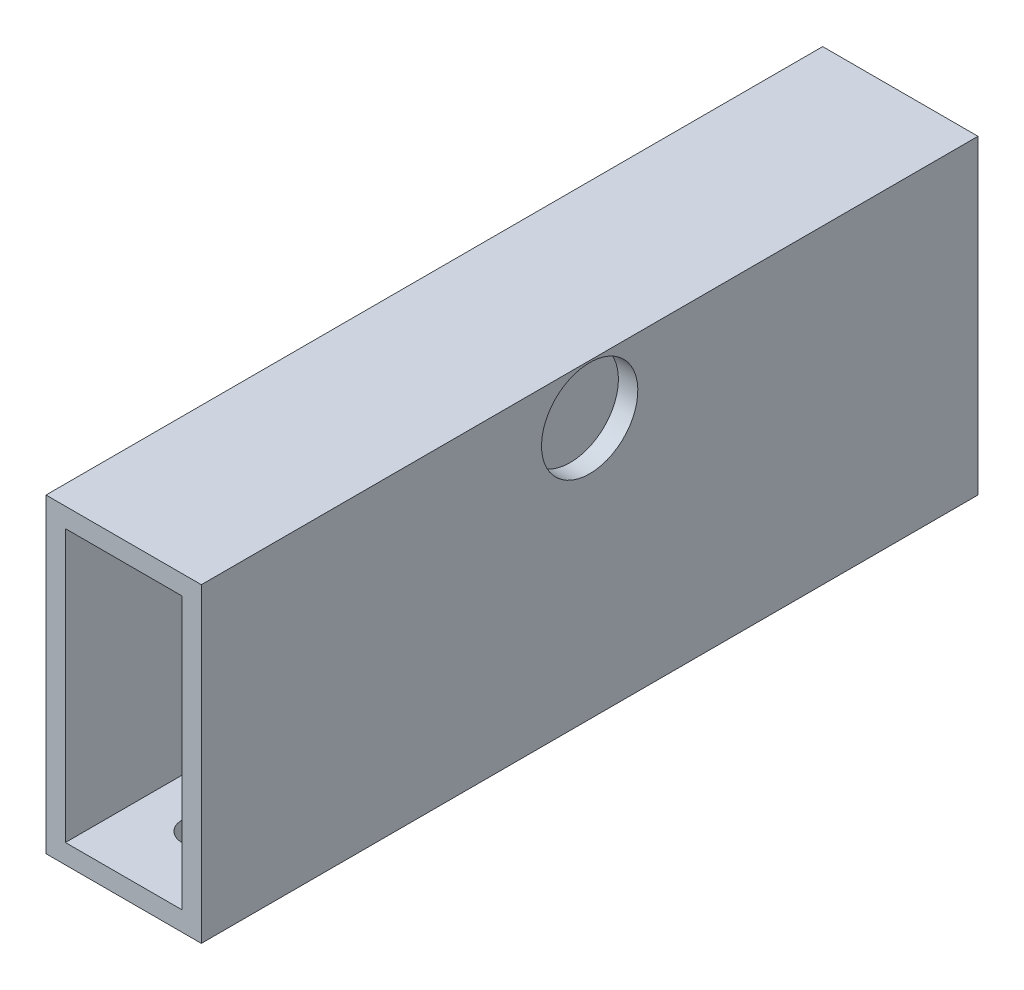
ISO-10303-21;
HEADER;
FILE_DESCRIPTION(('STEP AP214'),'2;1');
FILE_NAME('part.step','',(''),(''),'','','');
FILE_SCHEMA(('AUTOMOTIVE_DESIGN { 1 0 10303 214 1 1 1 1 }'));
ENDSEC;
DATA;
#1=APPLICATION_CONTEXT('core data for automotive mechanical design processes');
#2=APPLICATION_PROTOCOL_DEFINITION('international standard','automotive_design',2000,#1);
#3=PRODUCT_CONTEXT('',#1,'mechanical');
#4=PRODUCT('Part','Part','',(#3));
#5=PRODUCT_RELATED_PRODUCT_CATEGORY('part','',(#4));
#6=PRODUCT_DEFINITION_FORMATION('','',#4);
#7=PRODUCT_DEFINITION_CONTEXT('part definition',#1,'design');
#8=PRODUCT_DEFINITION('design','',#6,#7);
#9=PRODUCT_DEFINITION_SHAPE('','',#8);
#10=(LENGTH_UNIT() NAMED_UNIT(*) SI_UNIT(.MILLI.,.METRE.));
#11=(NAMED_UNIT(*) PLANE_ANGLE_UNIT() SI_UNIT($,.RADIAN.));
#12=(NAMED_UNIT(*) SI_UNIT($,.STERADIAN.) SOLID_ANGLE_UNIT());
#13=UNCERTAINTY_MEASURE_WITH_UNIT(LENGTH_MEASURE(1.E-05),#10,'distance_accuracy_value','');
#14=(GEOMETRIC_REPRESENTATION_CONTEXT(3) GLOBAL_UNCERTAINTY_ASSIGNED_CONTEXT((#13)) GLOBAL_UNIT_ASSIGNED_CONTEXT((#10,
#11,#12)) REPRESENTATION_CONTEXT('',''));
#15=CARTESIAN_POINT('',(0.,0.,0.));
#16=DIRECTION('',(0.,0.,1.));
#17=DIRECTION('',(1.,0.,0.));
#18=AXIS2_PLACEMENT_3D('',#15,#16,#17);
#19=CARTESIAN_POINT('',(-8.94261434192302,17.1332240360006,63.5));
#20=DIRECTION('',(0.,-1.,0.));
#21=DIRECTION('',(0.,0.,-1.));
#22=AXIS2_PLACEMENT_3D('',#19,#20,#21);
#23=PLANE('',#22);
#24=DIRECTION('',(-1.,0.,0.));
#25=VECTOR('',#24,1.);
#26=CARTESIAN_POINT('',(13.282385658077,17.1332240360006,6.08672387561791));
#27=LINE('',#26,#25);
#28=CARTESIAN_POINT('',(10.107385658077,17.1332240360006,6.08672387561791));
#29=VERTEX_POINT('',#28);
#30=CARTESIAN_POINT('',(-8.94261434192302,17.1332240360006,6.08672387561791));
#31=VERTEX_POINT('',#30);
#32=EDGE_CURVE('E11',#29,#31,#27,.T.);
#33=ORIENTED_EDGE('',*,*,#32,.F.);
#34=DIRECTION('',(0.,0.,-1.));
#35=VECTOR('',#34,1.);
#36=CARTESIAN_POINT('',(10.107385658077,17.1332240360006,63.5));
#37=LINE('',#36,#35);
#38=CARTESIAN_POINT('',(10.107385658077,17.1332240360006,63.5));
#39=VERTEX_POINT('',#38);
#40=EDGE_CURVE('E55',#39,#29,#37,.T.);
#41=ORIENTED_EDGE('',*,*,#40,.F.);
#42=DIRECTION('',(-1.,0.,0.));
#43=VECTOR('',#42,1.);
#44=CARTESIAN_POINT('',(-8.94261434192302,17.1332240360006,63.5));
#45=LINE('',#44,#43);
#46=CARTESIAN_POINT('',(-8.94261434192302,17.1332240360006,63.5));
#47=VERTEX_POINT('',#46);
#48=EDGE_CURVE('E202',#39,#47,#45,.T.);
#49=ORIENTED_EDGE('',*,*,#48,.T.);
#50=DIRECTION('',(0.,0.,-1.));
#51=VECTOR('',#50,1.);
#52=CARTESIAN_POINT('',(-8.94261434192302,17.1332240360006,63.5));
#53=LINE('',#52,#51);
#54=EDGE_CURVE('E126',#47,#31,#53,.T.);
#55=ORIENTED_EDGE('',*,*,#54,.T.);
#56=EDGE_LOOP('',(#33,#41,#49,#55));
#57=FACE_BOUND('',#56,.T.);
#58=ADVANCED_FACE('F33',(#57),#23,.T.);
#59=CARTESIAN_POINT('',(0.,0.,63.5));
#60=DIRECTION('',(0.,0.,1.));
#61=DIRECTION('',(1.,0.,0.));
#62=AXIS2_PLACEMENT_3D('',#59,#60,#61);
#63=PLANE('',#62);
#64=DIRECTION('',(0.,-1.,0.));
#65=VECTOR('',#64,1.);
#66=CARTESIAN_POINT('',(-12.117614341923,20.3082240360006,63.5));
#67=LINE('',#66,#65);
#68=CARTESIAN_POINT('',(-12.117614341923,20.3082240360006,63.5));
#69=VERTEX_POINT('',#68);
#70=CARTESIAN_POINT('',(-12.117614341923,-30.4917759639994,63.5));
#71=VERTEX_POINT('',#70);
#72=EDGE_CURVE('E139',#69,#71,#67,.T.);
#73=ORIENTED_EDGE('',*,*,#72,.T.);
#74=DIRECTION('',(1.,0.,0.));
#75=VECTOR('',#74,1.);
#76=CARTESIAN_POINT('',(-12.117614341923,-30.4917759639994,63.5));
#77=LINE('',#76,#75);
#78=CARTESIAN_POINT('',(13.282385658077,-30.4917759639994,63.5));
#79=VERTEX_POINT('',#78);
#80=EDGE_CURVE('E142',#71,#79,#77,.T.);
#81=ORIENTED_EDGE('',*,*,#80,.T.);
#82=DIRECTION('',(0.,1.,0.));
#83=VECTOR('',#82,1.);
#84=CARTESIAN_POINT('',(13.282385658077,20.3082240360006,63.5));
#85=LINE('',#84,#83);
#86=CARTESIAN_POINT('',(13.282385658077,20.3082240360006,63.5));
#87=VERTEX_POINT('',#86);
#88=EDGE_CURVE('E145',#79,#87,#85,.T.);
#89=ORIENTED_EDGE('',*,*,#88,.T.);
#90=DIRECTION('',(-1.,0.,0.));
#91=VECTOR('',#90,1.);
#92=CARTESIAN_POINT('',(-12.117614341923,20.3082240360006,63.5));
#93=LINE('',#92,#91);
#94=EDGE_CURVE('E147',#87,#69,#93,.T.);
#95=ORIENTED_EDGE('',*,*,#94,.T.);
#96=EDGE_LOOP('',(#73,#81,#89,#95));
#97=FACE_BOUND('',#96,.T.);
#98=DIRECTION('',(1.,0.,0.));
#99=VECTOR('',#98,1.);
#100=CARTESIAN_POINT('',(-8.94261434192302,-27.3167759639994,63.5));
#101=LINE('',#100,#99);
#102=CARTESIAN_POINT('',(-8.94261434192302,-27.3167759639994,63.5));
#103=VERTEX_POINT('',#102);
#104=CARTESIAN_POINT('',(10.107385658077,-27.3167759639994,63.5));
#105=VERTEX_POINT('',#104);
#106=EDGE_CURVE('E194',#103,#105,#101,.T.);
#107=ORIENTED_EDGE('',*,*,#106,.F.);
#108=DIRECTION('',(0.,-1.,0.));
#109=VECTOR('',#108,1.);
#110=CARTESIAN_POINT('',(-8.94261434192302,17.1332240360006,63.5));
#111=LINE('',#110,#109);
#112=EDGE_CURVE('E196',#47,#103,#111,.T.);
#113=ORIENTED_EDGE('',*,*,#112,.F.);
#114=ORIENTED_EDGE('',*,*,#48,.F.);
#115=DIRECTION('',(0.,1.,0.));
#116=VECTOR('',#115,1.);
#117=CARTESIAN_POINT('',(10.107385658077,17.1332240360006,63.5));
#118=LINE('',#117,#116);
#119=EDGE_CURVE('E197',#105,#39,#118,.T.);
#120=ORIENTED_EDGE('',*,*,#119,.F.);
#121=EDGE_LOOP('',(#107,#113,#114,#120));
#122=FACE_BOUND('',#121,.T.);
#123=ADVANCED_FACE('F187',(#97,#122),#63,.T.);
#124=CARTESIAN_POINT('',(0.,0.,-63.5));
#125=DIRECTION('',(0.,0.,1.));
#126=DIRECTION('',(1.,0.,0.));
#127=AXIS2_PLACEMENT_3D('',#124,#125,#126);
#128=PLANE('',#127);
#129=DIRECTION('',(0.,-1.,0.));
#130=VECTOR('',#129,1.);
#131=CARTESIAN_POINT('',(-12.117614341923,20.3082240360006,-63.5));
#132=LINE('',#131,#130);
#133=CARTESIAN_POINT('',(-12.117614341923,20.3082240360006,-63.5));
#134=VERTEX_POINT('',#133);
#135=CARTESIAN_POINT('',(-12.117614341923,-30.4917759639994,-63.5));
#136=VERTEX_POINT('',#135);
#137=EDGE_CURVE('E138',#134,#136,#132,.T.);
#138=ORIENTED_EDGE('',*,*,#137,.F.);
#139=DIRECTION('',(-1.,0.,0.));
#140=VECTOR('',#139,1.);
#141=CARTESIAN_POINT('',(-12.117614341923,20.3082240360006,-63.5));
#142=LINE('',#141,#140);
#143=CARTESIAN_POINT('',(13.282385658077,20.3082240360006,-63.5));
#144=VERTEX_POINT('',#143);
#145=EDGE_CURVE('E143',#144,#134,#142,.T.);
#146=ORIENTED_EDGE('',*,*,#145,.F.);
#147=DIRECTION('',(0.,1.,0.));
#148=VECTOR('',#147,1.);
#149=CARTESIAN_POINT('',(13.282385658077,20.3082240360006,-63.5));
#150=LINE('',#149,#148);
#151=CARTESIAN_POINT('',(13.282385658077,-30.4917759639994,-63.5));
#152=VERTEX_POINT('',#151);
#153=EDGE_CURVE('E154',#152,#144,#150,.T.);
#154=ORIENTED_EDGE('',*,*,#153,.F.);
#155=DIRECTION('',(1.,0.,0.));
#156=VECTOR('',#155,1.);
#157=CARTESIAN_POINT('',(-12.117614341923,-30.4917759639994,-63.5));
#158=LINE('',#157,#156);
#159=EDGE_CURVE('E152',#136,#152,#158,.T.);
#160=ORIENTED_EDGE('',*,*,#159,.F.);
#161=EDGE_LOOP('',(#138,#146,#154,#160));
#162=FACE_BOUND('',#161,.T.);
#163=DIRECTION('',(0.,-1.,0.));
#164=VECTOR('',#163,1.);
#165=CARTESIAN_POINT('',(-8.94261434192302,17.1332240360006,-63.5));
#166=LINE('',#165,#164);
#167=CARTESIAN_POINT('',(-8.94261434192302,17.1332240360006,-63.5));
#168=VERTEX_POINT('',#167);
#169=CARTESIAN_POINT('',(-8.94261434192302,-27.3167759639994,-63.5));
#170=VERTEX_POINT('',#169);
#171=EDGE_CURVE('E208',#168,#170,#166,.T.);
#172=ORIENTED_EDGE('',*,*,#171,.T.);
#173=DIRECTION('',(1.,0.,0.));
#174=VECTOR('',#173,1.);
#175=CARTESIAN_POINT('',(-8.94261434192302,-27.3167759639994,-63.5));
#176=LINE('',#175,#174);
#177=CARTESIAN_POINT('',(10.107385658077,-27.3167759639994,-63.5));
#178=VERTEX_POINT('',#177);
#179=EDGE_CURVE('E211',#170,#178,#176,.T.);
#180=ORIENTED_EDGE('',*,*,#179,.T.);
#181=DIRECTION('',(0.,1.,0.));
#182=VECTOR('',#181,1.);
#183=CARTESIAN_POINT('',(10.107385658077,17.1332240360006,-63.5));
#184=LINE('',#183,#182);
#185=CARTESIAN_POINT('',(10.107385658077,17.1332240360006,-63.5));
#186=VERTEX_POINT('',#185);
#187=EDGE_CURVE('E214',#178,#186,#184,.T.);
#188=ORIENTED_EDGE('',*,*,#187,.T.);
#189=DIRECTION('',(-1.,0.,0.));
#190=VECTOR('',#189,1.);
#191=CARTESIAN_POINT('',(-8.94261434192302,17.1332240360006,-63.5));
#192=LINE('',#191,#190);
#193=EDGE_CURVE('E124',#186,#168,#192,.T.);
#194=ORIENTED_EDGE('',*,*,#193,.T.);
#195=EDGE_LOOP('',(#172,#180,#188,#194));
#196=FACE_BOUND('',#195,.T.);
#197=ADVANCED_FACE('F176',(#162,#196),#128,.F.);
#198=CARTESIAN_POINT('',(-12.117614341923,20.3082240360006,63.5));
#199=DIRECTION('',(1.,0.,0.));
#200=DIRECTION('',(0.,1.,0.));
#201=AXIS2_PLACEMENT_3D('',#198,#199,#200);
#202=PLANE('',#201);
#203=CARTESIAN_POINT('',(-12.117614341923,12.1380595280006,0.));
#204=DIRECTION('',(-1.,0.,0.));
#205=DIRECTION('',(0.,-1.,0.));
#206=AXIS2_PLACEMENT_3D('',#203,#204,#205);
#207=CIRCLE('',#206,7.874);
#208=CARTESIAN_POINT('',(-12.117614341923,4.26405952800063,0.));
#209=VERTEX_POINT('',#208);
#210=EDGE_CURVE('E264',#209,#209,#207,.T.);
#211=ORIENTED_EDGE('',*,*,#210,.F.);
#212=EDGE_LOOP('',(#211));
#213=FACE_BOUND('',#212,.T.);
#214=ORIENTED_EDGE('',*,*,#137,.T.);
#215=DIRECTION('',(0.,0.,-1.));
#216=VECTOR('',#215,1.);
#217=CARTESIAN_POINT('',(-12.117614341923,-30.4917759639994,63.5));
#218=LINE('',#217,#216);
#219=EDGE_CURVE('E114',#71,#136,#218,.T.);
#220=ORIENTED_EDGE('',*,*,#219,.F.);
#221=ORIENTED_EDGE('',*,*,#72,.F.);
#222=DIRECTION('',(0.,0.,-1.));
#223=VECTOR('',#222,1.);
#224=CARTESIAN_POINT('',(-12.117614341923,20.3082240360006,63.5));
#225=LINE('',#224,#223);
#226=EDGE_CURVE('E149',#69,#134,#225,.T.);
#227=ORIENTED_EDGE('',*,*,#226,.T.);
#228=EDGE_LOOP('',(#214,#220,#221,#227));
#229=FACE_BOUND('',#228,.T.);
#230=ADVANCED_FACE('F35',(#213,#229),#202,.F.);
#231=CARTESIAN_POINT('',(-12.117614341923,-30.4917759639994,63.5));
#232=DIRECTION('',(0.,1.,0.));
#233=DIRECTION('',(0.,0.,1.));
#234=AXIS2_PLACEMENT_3D('',#231,#232,#233);
#235=PLANE('',#234);
#236=CARTESIAN_POINT('',(0.582385658076988,-30.4917759639994,-50.8));
#237=DIRECTION('',(0.,-1.,0.));
#238=DIRECTION('',(0.,0.,-1.));
#239=AXIS2_PLACEMENT_3D('',#236,#237,#238);
#240=CIRCLE('',#239,3.175);
#241=CARTESIAN_POINT('',(0.582385658076988,-30.4917759639994,-53.975));
#242=VERTEX_POINT('',#241);
#243=EDGE_CURVE('E255',#242,#242,#240,.T.);
#244=ORIENTED_EDGE('',*,*,#243,.F.);
#245=EDGE_LOOP('',(#244));
#246=FACE_BOUND('',#245,.T.);
#247=CARTESIAN_POINT('',(0.58238565807699,-30.4917759639994,50.8));
#248=DIRECTION('',(0.,-1.,0.));
#249=DIRECTION('',(0.,0.,-1.));
#250=AXIS2_PLACEMENT_3D('',#247,#248,#249);
#251=CIRCLE('',#250,3.175);
#252=CARTESIAN_POINT('',(0.58238565807699,-30.4917759639994,47.625));
#253=VERTEX_POINT('',#252);
#254=EDGE_CURVE('E258',#253,#253,#251,.T.);
#255=ORIENTED_EDGE('',*,*,#254,.F.);
#256=EDGE_LOOP('',(#255));
#257=FACE_BOUND('',#256,.T.);
#258=ORIENTED_EDGE('',*,*,#159,.T.);
#259=DIRECTION('',(0.,0.,-1.));
#260=VECTOR('',#259,1.);
#261=CARTESIAN_POINT('',(13.282385658077,-30.4917759639994,63.5));
#262=LINE('',#261,#260);
#263=EDGE_CURVE('E162',#79,#152,#262,.T.);
#264=ORIENTED_EDGE('',*,*,#263,.F.);
#265=ORIENTED_EDGE('',*,*,#80,.F.);
#266=ORIENTED_EDGE('',*,*,#219,.T.);
#267=EDGE_LOOP('',(#258,#264,#265,#266));
#268=FACE_BOUND('',#267,.T.);
#269=ADVANCED_FACE('F168',(#246,#257,#268),#235,.F.);
#270=CARTESIAN_POINT('',(13.282385658077,20.3082240360006,63.5));
#271=DIRECTION('',(-1.,0.,0.));
#272=DIRECTION('',(0.,-1.,0.));
#273=AXIS2_PLACEMENT_3D('',#270,#271,#272);
#274=PLANE('',#273);
#275=CARTESIAN_POINT('',(13.282385658077,12.1380595280006,0.));
#276=DIRECTION('',(-1.,0.,0.));
#277=DIRECTION('',(0.,-1.,0.));
#278=AXIS2_PLACEMENT_3D('',#275,#276,#277);
#279=CIRCLE('',#278,7.874);
#280=CARTESIAN_POINT('',(13.282385658077,4.26405952800063,0.));
#281=VERTEX_POINT('',#280);
#282=EDGE_CURVE('E120',#281,#281,#279,.T.);
#283=ORIENTED_EDGE('',*,*,#282,.T.);
#284=EDGE_LOOP('',(#283));
#285=FACE_BOUND('',#284,.T.);
#286=ORIENTED_EDGE('',*,*,#153,.T.);
#287=DIRECTION('',(0.,0.,-1.));
#288=VECTOR('',#287,1.);
#289=CARTESIAN_POINT('',(13.282385658077,20.3082240360006,63.5));
#290=LINE('',#289,#288);
#291=EDGE_CURVE('E159',#87,#144,#290,.T.);
#292=ORIENTED_EDGE('',*,*,#291,.F.);
#293=ORIENTED_EDGE('',*,*,#88,.F.);
#294=ORIENTED_EDGE('',*,*,#263,.T.);
#295=EDGE_LOOP('',(#286,#292,#293,#294));
#296=FACE_BOUND('',#295,.T.);
#297=ADVANCED_FACE('F181',(#285,#296),#274,.F.);
#298=CARTESIAN_POINT('',(-12.117614341923,20.3082240360006,63.5));
#299=DIRECTION('',(0.,-1.,0.));
#300=DIRECTION('',(0.,0.,-1.));
#301=AXIS2_PLACEMENT_3D('',#298,#299,#300);
#302=PLANE('',#301);
#303=ORIENTED_EDGE('',*,*,#145,.T.);
#304=ORIENTED_EDGE('',*,*,#226,.F.);
#305=ORIENTED_EDGE('',*,*,#94,.F.);
#306=ORIENTED_EDGE('',*,*,#291,.T.);
#307=EDGE_LOOP('',(#303,#304,#305,#306));
#308=FACE_BOUND('',#307,.T.);
#309=ADVANCED_FACE('F185',(#308),#302,.F.);
#310=CARTESIAN_POINT('',(-8.94261434192302,17.1332240360006,63.5));
#311=DIRECTION('',(1.,0.,0.));
#312=DIRECTION('',(0.,0.,-1.));
#313=AXIS2_PLACEMENT_3D('',#310,#311,#312);
#314=PLANE('',#313);
#315=CARTESIAN_POINT('',(-8.94261434192302,12.1380595280006,0.));
#316=DIRECTION('',(1.,0.,0.));
#317=DIRECTION('',(0.,0.,-1.));
#318=AXIS2_PLACEMENT_3D('',#315,#316,#317);
#319=CIRCLE('',#318,7.874);
#320=CARTESIAN_POINT('',(-8.94261434192302,17.1332240360006,-6.08672387561791));
#321=VERTEX_POINT('',#320);
#322=EDGE_CURVE('E47',#31,#321,#319,.T.);
#323=ORIENTED_EDGE('',*,*,#322,.F.);
#324=ORIENTED_EDGE('',*,*,#54,.F.);
#325=ORIENTED_EDGE('',*,*,#112,.T.);
#326=DIRECTION('',(0.,0.,-1.));
#327=VECTOR('',#326,1.);
#328=CARTESIAN_POINT('',(-8.94261434192302,-27.3167759639994,63.5));
#329=LINE('',#328,#327);
#330=EDGE_CURVE('E135',#103,#170,#329,.T.);
#331=ORIENTED_EDGE('',*,*,#330,.T.);
#332=ORIENTED_EDGE('',*,*,#171,.F.);
#333=EDGE_CURVE('E130',#321,#168,#53,.T.);
#334=ORIENTED_EDGE('',*,*,#333,.F.);
#335=EDGE_LOOP('',(#323,#324,#325,#331,#332,#334));
#336=FACE_BOUND('',#335,.T.);
#337=ADVANCED_FACE('F218',(#336),#314,.T.);
#338=CARTESIAN_POINT('',(-8.94261434192302,-27.3167759639994,63.5));
#339=DIRECTION('',(0.,1.,0.));
#340=DIRECTION('',(-1.,0.,0.));
#341=AXIS2_PLACEMENT_3D('',#338,#339,#340);
#342=PLANE('',#341);
#343=CARTESIAN_POINT('',(0.582385658076988,-27.3167759639994,-50.8));
#344=DIRECTION('',(0.,-1.,0.));
#345=DIRECTION('',(0.,0.,-1.));
#346=AXIS2_PLACEMENT_3D('',#343,#344,#345);
#347=CIRCLE('',#346,3.175);
#348=CARTESIAN_POINT('',(0.582385658076988,-27.3167759639994,-53.975));
#349=VERTEX_POINT('',#348);
#350=EDGE_CURVE('E261',#349,#349,#347,.T.);
#351=ORIENTED_EDGE('',*,*,#350,.T.);
#352=EDGE_LOOP('',(#351));
#353=FACE_BOUND('',#352,.T.);
#354=CARTESIAN_POINT('',(0.58238565807699,-27.3167759639994,50.8));
#355=DIRECTION('',(0.,-1.,0.));
#356=DIRECTION('',(0.,0.,-1.));
#357=AXIS2_PLACEMENT_3D('',#354,#355,#356);
#358=CIRCLE('',#357,3.175);
#359=CARTESIAN_POINT('',(0.58238565807699,-27.3167759639994,47.625));
#360=VERTEX_POINT('',#359);
#361=EDGE_CURVE('E260',#360,#360,#358,.T.);
#362=ORIENTED_EDGE('',*,*,#361,.T.);
#363=EDGE_LOOP('',(#362));
#364=FACE_BOUND('',#363,.T.);
#365=ORIENTED_EDGE('',*,*,#179,.F.);
#366=ORIENTED_EDGE('',*,*,#330,.F.);
#367=ORIENTED_EDGE('',*,*,#106,.T.);
#368=DIRECTION('',(0.,0.,-1.));
#369=VECTOR('',#368,1.);
#370=CARTESIAN_POINT('',(10.107385658077,-27.3167759639994,63.5));
#371=LINE('',#370,#369);
#372=EDGE_CURVE('E128',#105,#178,#371,.T.);
#373=ORIENTED_EDGE('',*,*,#372,.T.);
#374=EDGE_LOOP('',(#365,#366,#367,#373));
#375=FACE_BOUND('',#374,.T.);
#376=ADVANCED_FACE('F216',(#353,#364,#375),#342,.T.);
#377=CARTESIAN_POINT('',(10.107385658077,17.1332240360006,63.5));
#378=DIRECTION('',(-1.,0.,0.));
#379=DIRECTION('',(0.,0.,1.));
#380=AXIS2_PLACEMENT_3D('',#377,#378,#379);
#381=PLANE('',#380);
#382=CARTESIAN_POINT('',(10.107385658077,12.1380595280006,0.));
#383=DIRECTION('',(-1.,0.,0.));
#384=DIRECTION('',(0.,0.,1.));
#385=AXIS2_PLACEMENT_3D('',#382,#383,#384);
#386=CIRCLE('',#385,7.874);
#387=CARTESIAN_POINT('',(10.107385658077,17.1332240360006,-6.08672387561791));
#388=VERTEX_POINT('',#387);
#389=EDGE_CURVE('E110',#388,#29,#386,.T.);
#390=ORIENTED_EDGE('',*,*,#389,.F.);
#391=EDGE_CURVE('E118',#388,#186,#37,.T.);
#392=ORIENTED_EDGE('',*,*,#391,.T.);
#393=ORIENTED_EDGE('',*,*,#187,.F.);
#394=ORIENTED_EDGE('',*,*,#372,.F.);
#395=ORIENTED_EDGE('',*,*,#119,.T.);
#396=ORIENTED_EDGE('',*,*,#40,.T.);
#397=EDGE_LOOP('',(#390,#392,#393,#394,#395,#396));
#398=FACE_BOUND('',#397,.T.);
#399=ADVANCED_FACE('F116',(#398),#381,.T.);
#400=DIRECTION('',(-1.,0.,0.));
#401=VECTOR('',#400,1.);
#402=CARTESIAN_POINT('',(13.282385658077,17.1332240360006,-6.08672387561791));
#403=LINE('',#402,#401);
#404=EDGE_CURVE('E41',#321,#388,#403,.F.);
#405=ORIENTED_EDGE('',*,*,#404,.F.);
#406=ORIENTED_EDGE('',*,*,#333,.T.);
#407=ORIENTED_EDGE('',*,*,#193,.F.);
#408=ORIENTED_EDGE('',*,*,#391,.F.);
#409=EDGE_LOOP('',(#405,#406,#407,#408));
#410=FACE_BOUND('',#409,.T.);
#411=ADVANCED_FACE('F122',(#410),#23,.T.);
#412=CARTESIAN_POINT('',(13.282385658077,12.1380595280006,0.));
#413=DIRECTION('',(-1.,0.,0.));
#414=DIRECTION('',(0.,-1.,0.));
#415=AXIS2_PLACEMENT_3D('',#412,#413,#414);
#416=CYLINDRICAL_SURFACE('',#415,7.874);
#417=ORIENTED_EDGE('',*,*,#32,.T.);
#418=ORIENTED_EDGE('',*,*,#322,.T.);
#419=ORIENTED_EDGE('',*,*,#404,.T.);
#420=ORIENTED_EDGE('',*,*,#389,.T.);
#421=EDGE_LOOP('',(#417,#418,#419,#420));
#422=FACE_BOUND('',#421,.T.);
#423=ORIENTED_EDGE('',*,*,#282,.F.);
#424=EDGE_LOOP('',(#423));
#425=FACE_BOUND('',#424,.T.);
#426=ORIENTED_EDGE('',*,*,#210,.T.);
#427=EDGE_LOOP('',(#426));
#428=FACE_BOUND('',#427,.T.);
#429=ADVANCED_FACE('F108',(#422,#425,#428),#416,.F.);
#430=CARTESIAN_POINT('',(0.58238565807699,-27.3167759639994,50.8));
#431=DIRECTION('',(0.,-1.,0.));
#432=DIRECTION('',(0.,0.,-1.));
#433=AXIS2_PLACEMENT_3D('',#430,#431,#432);
#434=CYLINDRICAL_SURFACE('',#433,3.175);
#435=ORIENTED_EDGE('',*,*,#361,.F.);
#436=EDGE_LOOP('',(#435));
#437=FACE_BOUND('',#436,.T.);
#438=ORIENTED_EDGE('',*,*,#254,.T.);
#439=EDGE_LOOP('',(#438));
#440=FACE_BOUND('',#439,.T.);
#441=ADVANCED_FACE('F231',(#437,#440),#434,.F.);
#442=CARTESIAN_POINT('',(0.582385658076988,-27.3167759639994,-50.8));
#443=DIRECTION('',(0.,-1.,0.));
#444=DIRECTION('',(0.,0.,-1.));
#445=AXIS2_PLACEMENT_3D('',#442,#443,#444);
#446=CYLINDRICAL_SURFACE('',#445,3.175);
#447=ORIENTED_EDGE('',*,*,#350,.F.);
#448=EDGE_LOOP('',(#447));
#449=FACE_BOUND('',#448,.T.);
#450=ORIENTED_EDGE('',*,*,#243,.T.);
#451=EDGE_LOOP('',(#450));
#452=FACE_BOUND('',#451,.T.);
#453=ADVANCED_FACE('F277',(#449,#452),#446,.F.);
#454=CLOSED_SHELL('',(#58,#123,#197,#230,#269,#297,#309,#337,#376,#399,#411,#429,#441,#453));
#455=MANIFOLD_SOLID_BREP('B2',#454);
#456=ADVANCED_BREP_SHAPE_REPRESENTATION('',(#18,#455),#14);
#457=SHAPE_DEFINITION_REPRESENTATION(#9,#456);
ENDSEC;
END-ISO-10303-21;
